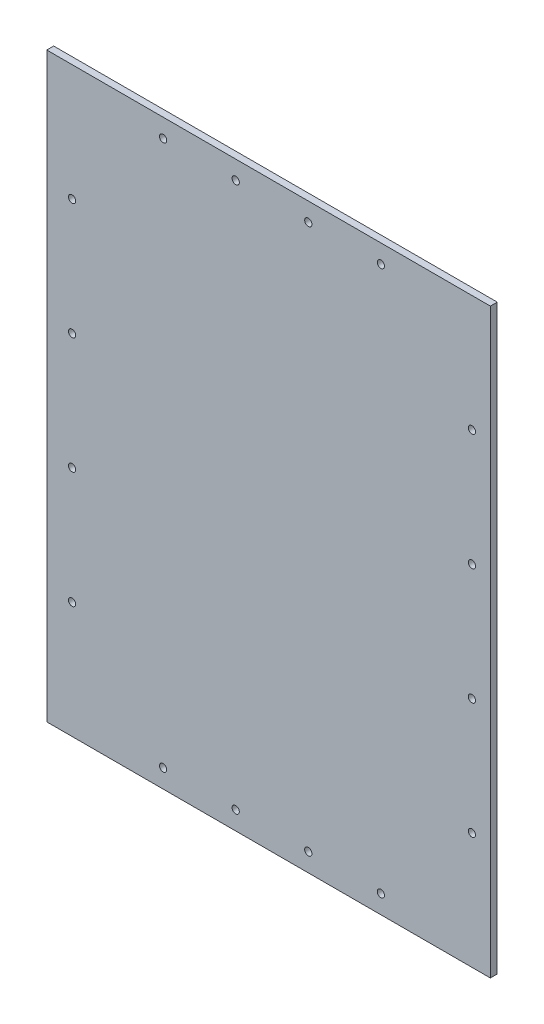
ISO-10303-21;
HEADER;
FILE_DESCRIPTION(('STEP AP214'),'2;1');
FILE_NAME('part.step','',(''),(''),'','','');
FILE_SCHEMA(('AUTOMOTIVE_DESIGN { 1 0 10303 214 1 1 1 1 }'));
ENDSEC;
DATA;
#1=APPLICATION_CONTEXT('core data for automotive mechanical design processes');
#2=APPLICATION_PROTOCOL_DEFINITION('international standard','automotive_design',2000,#1);
#3=PRODUCT_CONTEXT('',#1,'mechanical');
#4=PRODUCT('Part','Part','',(#3));
#5=PRODUCT_RELATED_PRODUCT_CATEGORY('part','',(#4));
#6=PRODUCT_DEFINITION_FORMATION('','',#4);
#7=PRODUCT_DEFINITION_CONTEXT('part definition',#1,'design');
#8=PRODUCT_DEFINITION('design','',#6,#7);
#9=PRODUCT_DEFINITION_SHAPE('','',#8);
#10=(LENGTH_UNIT() NAMED_UNIT(*) SI_UNIT(.MILLI.,.METRE.));
#11=(NAMED_UNIT(*) PLANE_ANGLE_UNIT() SI_UNIT($,.RADIAN.));
#12=(NAMED_UNIT(*) SI_UNIT($,.STERADIAN.) SOLID_ANGLE_UNIT());
#13=UNCERTAINTY_MEASURE_WITH_UNIT(LENGTH_MEASURE(1.E-05),#10,'distance_accuracy_value','');
#14=(GEOMETRIC_REPRESENTATION_CONTEXT(3) GLOBAL_UNCERTAINTY_ASSIGNED_CONTEXT((#13)) GLOBAL_UNIT_ASSIGNED_CONTEXT((#10,
#11,#12)) REPRESENTATION_CONTEXT('',''));
#15=CARTESIAN_POINT('',(0.,0.,0.));
#16=DIRECTION('',(0.,0.,1.));
#17=DIRECTION('',(1.,0.,0.));
#18=AXIS2_PLACEMENT_3D('',#15,#16,#17);
#19=CARTESIAN_POINT('',(-152.775,198.025,-0.00999999999999959));
#20=DIRECTION('',(0.,-1.,0.));
#21=DIRECTION('',(1.,0.,0.));
#22=AXIS2_PLACEMENT_3D('',#19,#20,#21);
#23=PLANE('',#22);
#24=DIRECTION('',(0.,0.,-1.));
#25=VECTOR('',#24,1.);
#26=CARTESIAN_POINT('',(-152.775,198.025,4.75));
#27=LINE('',#26,#25);
#28=CARTESIAN_POINT('',(-152.775,198.025,4.75));
#29=VERTEX_POINT('',#28);
#30=CARTESIAN_POINT('',(-152.775,198.025,0.));
#31=VERTEX_POINT('',#30);
#32=EDGE_CURVE('E40',#29,#31,#27,.T.);
#33=ORIENTED_EDGE('',*,*,#32,.F.);
#34=DIRECTION('',(1.,0.,0.));
#35=VECTOR('',#34,1.);
#36=CARTESIAN_POINT('',(0.,198.025,4.75));
#37=LINE('',#36,#35);
#38=CARTESIAN_POINT('',(152.775,198.025,4.75));
#39=VERTEX_POINT('',#38);
#40=EDGE_CURVE('E11',#29,#39,#37,.T.);
#41=ORIENTED_EDGE('',*,*,#40,.T.);
#42=DIRECTION('',(0.,0.,1.));
#43=VECTOR('',#42,1.);
#44=CARTESIAN_POINT('',(152.775,198.025,-0.00999999999999959));
#45=LINE('',#44,#43);
#46=CARTESIAN_POINT('',(152.775,198.025,0.));
#47=VERTEX_POINT('',#46);
#48=EDGE_CURVE('E35',#47,#39,#45,.T.);
#49=ORIENTED_EDGE('',*,*,#48,.F.);
#50=DIRECTION('',(1.,0.,0.));
#51=VECTOR('',#50,1.);
#52=CARTESIAN_POINT('',(0.,198.025,0.));
#53=LINE('',#52,#51);
#54=EDGE_CURVE('E94',#31,#47,#53,.T.);
#55=ORIENTED_EDGE('',*,*,#54,.F.);
#56=EDGE_LOOP('',(#33,#41,#49,#55));
#57=FACE_BOUND('',#56,.T.);
#58=ADVANCED_FACE('F32',(#57),#23,.F.);
#59=CARTESIAN_POINT('',(152.775,-202.775,4.75));
#60=DIRECTION('',(0.,1.,0.));
#61=DIRECTION('',(-1.,0.,0.));
#62=AXIS2_PLACEMENT_3D('',#59,#60,#61);
#63=PLANE('',#62);
#64=DIRECTION('',(1.,0.,0.));
#65=VECTOR('',#64,1.);
#66=CARTESIAN_POINT('',(152.775,-202.775,0.));
#67=LINE('',#66,#65);
#68=CARTESIAN_POINT('',(-152.775,-202.775,0.));
#69=VERTEX_POINT('',#68);
#70=CARTESIAN_POINT('',(152.775,-202.775,0.));
#71=VERTEX_POINT('',#70);
#72=EDGE_CURVE('E130',#69,#71,#67,.T.);
#73=ORIENTED_EDGE('',*,*,#72,.T.);
#74=DIRECTION('',(0.,0.,-1.));
#75=VECTOR('',#74,1.);
#76=CARTESIAN_POINT('',(152.775,-202.775,4.75));
#77=LINE('',#76,#75);
#78=CARTESIAN_POINT('',(152.775,-202.775,4.75));
#79=VERTEX_POINT('',#78);
#80=EDGE_CURVE('E87',#79,#71,#77,.T.);
#81=ORIENTED_EDGE('',*,*,#80,.F.);
#82=DIRECTION('',(1.,0.,0.));
#83=VECTOR('',#82,1.);
#84=CARTESIAN_POINT('',(152.775,-202.775,4.75));
#85=LINE('',#84,#83);
#86=CARTESIAN_POINT('',(-152.775,-202.775,4.75));
#87=VERTEX_POINT('',#86);
#88=EDGE_CURVE('E75',#87,#79,#85,.T.);
#89=ORIENTED_EDGE('',*,*,#88,.F.);
#90=DIRECTION('',(0.,0.,-1.));
#91=VECTOR('',#90,1.);
#92=CARTESIAN_POINT('',(-152.775,-202.775,4.75));
#93=LINE('',#92,#91);
#94=EDGE_CURVE('E85',#87,#69,#93,.T.);
#95=ORIENTED_EDGE('',*,*,#94,.T.);
#96=EDGE_LOOP('',(#73,#81,#89,#95));
#97=FACE_BOUND('',#96,.T.);
#98=ADVANCED_FACE('F84',(#97),#63,.F.);
#99=CARTESIAN_POINT('',(152.775,-202.775,4.75));
#100=DIRECTION('',(-1.,0.,0.));
#101=DIRECTION('',(0.,0.,1.));
#102=AXIS2_PLACEMENT_3D('',#99,#100,#101);
#103=PLANE('',#102);
#104=DIRECTION('',(0.,1.,0.));
#105=VECTOR('',#104,1.);
#106=CARTESIAN_POINT('',(152.775,-202.775,0.));
#107=LINE('',#106,#105);
#108=EDGE_CURVE('E80',#71,#47,#107,.T.);
#109=ORIENTED_EDGE('',*,*,#108,.T.);
#110=ORIENTED_EDGE('',*,*,#48,.T.);
#111=DIRECTION('',(0.,1.,0.));
#112=VECTOR('',#111,1.);
#113=CARTESIAN_POINT('',(152.775,-202.775,4.75));
#114=LINE('',#113,#112);
#115=EDGE_CURVE('E88',#79,#39,#114,.T.);
#116=ORIENTED_EDGE('',*,*,#115,.F.);
#117=ORIENTED_EDGE('',*,*,#80,.T.);
#118=EDGE_LOOP('',(#109,#110,#116,#117));
#119=FACE_BOUND('',#118,.T.);
#120=ADVANCED_FACE('F134',(#119),#103,.F.);
#121=CARTESIAN_POINT('',(-152.775,-202.775,4.75));
#122=DIRECTION('',(1.,0.,0.));
#123=DIRECTION('',(0.,0.,-1.));
#124=AXIS2_PLACEMENT_3D('',#121,#122,#123);
#125=PLANE('',#124);
#126=DIRECTION('',(0.,-1.,0.));
#127=VECTOR('',#126,1.);
#128=CARTESIAN_POINT('',(-152.775,-202.775,4.75));
#129=LINE('',#128,#127);
#130=EDGE_CURVE('E71',#29,#87,#129,.T.);
#131=ORIENTED_EDGE('',*,*,#130,.F.);
#132=ORIENTED_EDGE('',*,*,#32,.T.);
#133=DIRECTION('',(0.,-1.,0.));
#134=VECTOR('',#133,1.);
#135=CARTESIAN_POINT('',(-152.775,-202.775,0.));
#136=LINE('',#135,#134);
#137=EDGE_CURVE('E92',#31,#69,#136,.T.);
#138=ORIENTED_EDGE('',*,*,#137,.T.);
#139=ORIENTED_EDGE('',*,*,#94,.F.);
#140=EDGE_LOOP('',(#131,#132,#138,#139));
#141=FACE_BOUND('',#140,.T.);
#142=ADVANCED_FACE('F90',(#141),#125,.F.);
#143=CARTESIAN_POINT('',(140.075,37.705,-5.25));
#144=DIRECTION('',(0.,0.,1.));
#145=DIRECTION('',(1.,0.,0.));
#146=AXIS2_PLACEMENT_3D('',#143,#144,#145);
#147=CYLINDRICAL_SURFACE('',#146,2.5);
#148=CARTESIAN_POINT('',(140.075,37.705,4.75));
#149=DIRECTION('',(0.,0.,1.));
#150=DIRECTION('',(1.,0.,0.));
#151=AXIS2_PLACEMENT_3D('',#148,#149,#150);
#152=CIRCLE('',#151,2.5);
#153=CARTESIAN_POINT('',(142.575,37.705,4.75));
#154=VERTEX_POINT('',#153);
#155=EDGE_CURVE('E104',#154,#154,#152,.T.);
#156=ORIENTED_EDGE('',*,*,#155,.T.);
#157=EDGE_LOOP('',(#156));
#158=FACE_BOUND('',#157,.T.);
#159=CARTESIAN_POINT('',(140.075,37.705,0.));
#160=DIRECTION('',(0.,0.,1.));
#161=DIRECTION('',(1.,0.,0.));
#162=AXIS2_PLACEMENT_3D('',#159,#160,#161);
#163=CIRCLE('',#162,2.5);
#164=CARTESIAN_POINT('',(142.575,37.705,0.));
#165=VERTEX_POINT('',#164);
#166=EDGE_CURVE('E100',#165,#165,#163,.T.);
#167=ORIENTED_EDGE('',*,*,#166,.F.);
#168=EDGE_LOOP('',(#167));
#169=FACE_BOUND('',#168,.T.);
#170=ADVANCED_FACE('F141',(#158,#169),#147,.F.);
#171=CARTESIAN_POINT('',(140.075,117.865,-5.25));
#172=DIRECTION('',(0.,0.,1.));
#173=DIRECTION('',(1.,0.,0.));
#174=AXIS2_PLACEMENT_3D('',#171,#172,#173);
#175=CYLINDRICAL_SURFACE('',#174,2.5);
#176=CARTESIAN_POINT('',(140.075,117.865,4.75));
#177=DIRECTION('',(0.,0.,1.));
#178=DIRECTION('',(1.,0.,0.));
#179=AXIS2_PLACEMENT_3D('',#176,#177,#178);
#180=CIRCLE('',#179,2.5);
#181=CARTESIAN_POINT('',(142.575,117.865,4.75));
#182=VERTEX_POINT('',#181);
#183=EDGE_CURVE('E284',#182,#182,#180,.T.);
#184=ORIENTED_EDGE('',*,*,#183,.T.);
#185=EDGE_LOOP('',(#184));
#186=FACE_BOUND('',#185,.T.);
#187=CARTESIAN_POINT('',(140.075,117.865,0.));
#188=DIRECTION('',(0.,0.,1.));
#189=DIRECTION('',(1.,0.,0.));
#190=AXIS2_PLACEMENT_3D('',#187,#188,#189);
#191=CIRCLE('',#190,2.5);
#192=CARTESIAN_POINT('',(142.575,117.865,0.));
#193=VERTEX_POINT('',#192);
#194=EDGE_CURVE('E103',#193,#193,#191,.T.);
#195=ORIENTED_EDGE('',*,*,#194,.F.);
#196=EDGE_LOOP('',(#195));
#197=FACE_BOUND('',#196,.T.);
#198=ADVANCED_FACE('F158',(#186,#197),#175,.F.);
#199=CARTESIAN_POINT('',(140.075,-42.455,-5.25));
#200=DIRECTION('',(0.,0.,1.));
#201=DIRECTION('',(1.,0.,0.));
#202=AXIS2_PLACEMENT_3D('',#199,#200,#201);
#203=CYLINDRICAL_SURFACE('',#202,2.5);
#204=CARTESIAN_POINT('',(140.075,-42.455,4.75));
#205=DIRECTION('',(0.,0.,1.));
#206=DIRECTION('',(1.,0.,0.));
#207=AXIS2_PLACEMENT_3D('',#204,#205,#206);
#208=CIRCLE('',#207,2.5);
#209=CARTESIAN_POINT('',(142.575,-42.455,4.75));
#210=VERTEX_POINT('',#209);
#211=EDGE_CURVE('E287',#210,#210,#208,.T.);
#212=ORIENTED_EDGE('',*,*,#211,.T.);
#213=EDGE_LOOP('',(#212));
#214=FACE_BOUND('',#213,.T.);
#215=CARTESIAN_POINT('',(140.075,-42.455,0.));
#216=DIRECTION('',(0.,0.,1.));
#217=DIRECTION('',(1.,0.,0.));
#218=AXIS2_PLACEMENT_3D('',#215,#216,#217);
#219=CIRCLE('',#218,2.5);
#220=CARTESIAN_POINT('',(142.575,-42.455,0.));
#221=VERTEX_POINT('',#220);
#222=EDGE_CURVE('E107',#221,#221,#219,.T.);
#223=ORIENTED_EDGE('',*,*,#222,.F.);
#224=EDGE_LOOP('',(#223));
#225=FACE_BOUND('',#224,.T.);
#226=ADVANCED_FACE('F164',(#214,#225),#203,.F.);
#227=CARTESIAN_POINT('',(140.075,-122.615,-5.25));
#228=DIRECTION('',(0.,0.,1.));
#229=DIRECTION('',(1.,0.,0.));
#230=AXIS2_PLACEMENT_3D('',#227,#228,#229);
#231=CYLINDRICAL_SURFACE('',#230,2.5);
#232=CARTESIAN_POINT('',(140.075,-122.615,4.75));
#233=DIRECTION('',(0.,0.,1.));
#234=DIRECTION('',(1.,0.,0.));
#235=AXIS2_PLACEMENT_3D('',#232,#233,#234);
#236=CIRCLE('',#235,2.5);
#237=CARTESIAN_POINT('',(142.575,-122.615,4.75));
#238=VERTEX_POINT('',#237);
#239=EDGE_CURVE('E125',#238,#238,#236,.T.);
#240=ORIENTED_EDGE('',*,*,#239,.T.);
#241=EDGE_LOOP('',(#240));
#242=FACE_BOUND('',#241,.T.);
#243=CARTESIAN_POINT('',(140.075,-122.615,0.));
#244=DIRECTION('',(0.,0.,1.));
#245=DIRECTION('',(1.,0.,0.));
#246=AXIS2_PLACEMENT_3D('',#243,#244,#245);
#247=CIRCLE('',#246,2.5);
#248=CARTESIAN_POINT('',(142.575,-122.615,0.));
#249=VERTEX_POINT('',#248);
#250=EDGE_CURVE('E110',#249,#249,#247,.T.);
#251=ORIENTED_EDGE('',*,*,#250,.F.);
#252=EDGE_LOOP('',(#251));
#253=FACE_BOUND('',#252,.T.);
#254=ADVANCED_FACE('F160',(#242,#253),#231,.F.);
#255=CARTESIAN_POINT('',(-135.325,117.865,-5.25));
#256=DIRECTION('',(0.,0.,1.));
#257=DIRECTION('',(1.,0.,0.));
#258=AXIS2_PLACEMENT_3D('',#255,#256,#257);
#259=CYLINDRICAL_SURFACE('',#258,2.5);
#260=CARTESIAN_POINT('',(-135.325,117.865,4.75));
#261=DIRECTION('',(0.,0.,1.));
#262=DIRECTION('',(1.,0.,0.));
#263=AXIS2_PLACEMENT_3D('',#260,#261,#262);
#264=CIRCLE('',#263,2.5);
#265=CARTESIAN_POINT('',(-132.825,117.865,4.75));
#266=VERTEX_POINT('',#265);
#267=EDGE_CURVE('E273',#266,#266,#264,.T.);
#268=ORIENTED_EDGE('',*,*,#267,.T.);
#269=EDGE_LOOP('',(#268));
#270=FACE_BOUND('',#269,.T.);
#271=CARTESIAN_POINT('',(-135.325,117.865,0.));
#272=DIRECTION('',(0.,0.,1.));
#273=DIRECTION('',(1.,0.,0.));
#274=AXIS2_PLACEMENT_3D('',#271,#272,#273);
#275=CIRCLE('',#274,2.5);
#276=CARTESIAN_POINT('',(-132.825,117.865,0.));
#277=VERTEX_POINT('',#276);
#278=EDGE_CURVE('E113',#277,#277,#275,.T.);
#279=ORIENTED_EDGE('',*,*,#278,.F.);
#280=EDGE_LOOP('',(#279));
#281=FACE_BOUND('',#280,.T.);
#282=ADVANCED_FACE('F163',(#270,#281),#259,.F.);
#283=CARTESIAN_POINT('',(-135.325,37.705,-5.25));
#284=DIRECTION('',(0.,0.,1.));
#285=DIRECTION('',(1.,0.,0.));
#286=AXIS2_PLACEMENT_3D('',#283,#284,#285);
#287=CYLINDRICAL_SURFACE('',#286,2.5);
#288=CARTESIAN_POINT('',(-135.325,37.705,4.75));
#289=DIRECTION('',(0.,0.,1.));
#290=DIRECTION('',(1.,0.,0.));
#291=AXIS2_PLACEMENT_3D('',#288,#289,#290);
#292=CIRCLE('',#291,2.5);
#293=CARTESIAN_POINT('',(-132.825,37.705,4.75));
#294=VERTEX_POINT('',#293);
#295=EDGE_CURVE('E279',#294,#294,#292,.T.);
#296=ORIENTED_EDGE('',*,*,#295,.T.);
#297=EDGE_LOOP('',(#296));
#298=FACE_BOUND('',#297,.T.);
#299=CARTESIAN_POINT('',(-135.325,37.705,0.));
#300=DIRECTION('',(0.,0.,1.));
#301=DIRECTION('',(1.,0.,0.));
#302=AXIS2_PLACEMENT_3D('',#299,#300,#301);
#303=CIRCLE('',#302,2.5);
#304=CARTESIAN_POINT('',(-132.825,37.705,0.));
#305=VERTEX_POINT('',#304);
#306=EDGE_CURVE('E116',#305,#305,#303,.T.);
#307=ORIENTED_EDGE('',*,*,#306,.F.);
#308=EDGE_LOOP('',(#307));
#309=FACE_BOUND('',#308,.T.);
#310=ADVANCED_FACE('F174',(#298,#309),#287,.F.);
#311=CARTESIAN_POINT('',(-135.325,-42.455,-5.25));
#312=DIRECTION('',(0.,0.,1.));
#313=DIRECTION('',(1.,0.,0.));
#314=AXIS2_PLACEMENT_3D('',#311,#312,#313);
#315=CYLINDRICAL_SURFACE('',#314,2.5);
#316=CARTESIAN_POINT('',(-135.325,-42.455,4.75));
#317=DIRECTION('',(0.,0.,1.));
#318=DIRECTION('',(1.,0.,0.));
#319=AXIS2_PLACEMENT_3D('',#316,#317,#318);
#320=CIRCLE('',#319,2.5);
#321=CARTESIAN_POINT('',(-132.825,-42.455,4.75));
#322=VERTEX_POINT('',#321);
#323=EDGE_CURVE('E276',#322,#322,#320,.T.);
#324=ORIENTED_EDGE('',*,*,#323,.T.);
#325=EDGE_LOOP('',(#324));
#326=FACE_BOUND('',#325,.T.);
#327=CARTESIAN_POINT('',(-135.325,-42.455,0.));
#328=DIRECTION('',(0.,0.,1.));
#329=DIRECTION('',(1.,0.,0.));
#330=AXIS2_PLACEMENT_3D('',#327,#328,#329);
#331=CIRCLE('',#330,2.5);
#332=CARTESIAN_POINT('',(-132.825,-42.455,0.));
#333=VERTEX_POINT('',#332);
#334=EDGE_CURVE('E120',#333,#333,#331,.T.);
#335=ORIENTED_EDGE('',*,*,#334,.F.);
#336=EDGE_LOOP('',(#335));
#337=FACE_BOUND('',#336,.T.);
#338=ADVANCED_FACE('F178',(#326,#337),#315,.F.);
#339=CARTESIAN_POINT('',(-135.325,-122.615,-5.25));
#340=DIRECTION('',(0.,0.,1.));
#341=DIRECTION('',(1.,0.,0.));
#342=AXIS2_PLACEMENT_3D('',#339,#340,#341);
#343=CYLINDRICAL_SURFACE('',#342,2.5);
#344=CARTESIAN_POINT('',(-135.325,-122.615,4.75));
#345=DIRECTION('',(0.,0.,1.));
#346=DIRECTION('',(1.,0.,0.));
#347=AXIS2_PLACEMENT_3D('',#344,#345,#346);
#348=CIRCLE('',#347,2.5);
#349=CARTESIAN_POINT('',(-132.825,-122.615,4.75));
#350=VERTEX_POINT('',#349);
#351=EDGE_CURVE('E117',#350,#350,#348,.T.);
#352=ORIENTED_EDGE('',*,*,#351,.T.);
#353=EDGE_LOOP('',(#352));
#354=FACE_BOUND('',#353,.T.);
#355=CARTESIAN_POINT('',(-135.325,-122.615,0.));
#356=DIRECTION('',(0.,0.,1.));
#357=DIRECTION('',(1.,0.,0.));
#358=AXIS2_PLACEMENT_3D('',#355,#356,#357);
#359=CIRCLE('',#358,2.5);
#360=CARTESIAN_POINT('',(-132.825,-122.615,0.));
#361=VERTEX_POINT('',#360);
#362=EDGE_CURVE('E123',#361,#361,#359,.T.);
#363=ORIENTED_EDGE('',*,*,#362,.F.);
#364=EDGE_LOOP('',(#363));
#365=FACE_BOUND('',#364,.T.);
#366=ADVANCED_FACE('F182',(#354,#365),#343,.F.);
#367=CARTESIAN_POINT('',(-22.625,185.325,10.));
#368=DIRECTION('',(0.,0.,-1.));
#369=DIRECTION('',(-1.,0.,0.));
#370=AXIS2_PLACEMENT_3D('',#367,#368,#369);
#371=CYLINDRICAL_SURFACE('',#370,2.5);
#372=CARTESIAN_POINT('',(-22.625,185.325,4.75));
#373=DIRECTION('',(0.,0.,1.));
#374=DIRECTION('',(1.,0.,0.));
#375=AXIS2_PLACEMENT_3D('',#372,#373,#374);
#376=CIRCLE('',#375,2.5);
#377=CARTESIAN_POINT('',(-20.125,185.325,4.75));
#378=VERTEX_POINT('',#377);
#379=EDGE_CURVE('E261',#378,#378,#376,.T.);
#380=ORIENTED_EDGE('',*,*,#379,.T.);
#381=EDGE_LOOP('',(#380));
#382=FACE_BOUND('',#381,.T.);
#383=CARTESIAN_POINT('',(-22.625,185.325,0.));
#384=DIRECTION('',(0.,0.,-1.));
#385=DIRECTION('',(-1.,0.,0.));
#386=AXIS2_PLACEMENT_3D('',#383,#384,#385);
#387=CIRCLE('',#386,2.5);
#388=CARTESIAN_POINT('',(-25.125,185.325,0.));
#389=VERTEX_POINT('',#388);
#390=EDGE_CURVE('E256',#389,#389,#387,.T.);
#391=ORIENTED_EDGE('',*,*,#390,.T.);
#392=EDGE_LOOP('',(#391));
#393=FACE_BOUND('',#392,.T.);
#394=ADVANCED_FACE('F186',(#382,#393),#371,.F.);
#395=CARTESIAN_POINT('',(27.375,185.325,10.));
#396=DIRECTION('',(0.,0.,-1.));
#397=DIRECTION('',(-1.,0.,0.));
#398=AXIS2_PLACEMENT_3D('',#395,#396,#397);
#399=CYLINDRICAL_SURFACE('',#398,2.5);
#400=CARTESIAN_POINT('',(27.375,185.325,4.75));
#401=DIRECTION('',(0.,0.,1.));
#402=DIRECTION('',(1.,0.,0.));
#403=AXIS2_PLACEMENT_3D('',#400,#401,#402);
#404=CIRCLE('',#403,2.5);
#405=CARTESIAN_POINT('',(29.875,185.325,4.75));
#406=VERTEX_POINT('',#405);
#407=EDGE_CURVE('E264',#406,#406,#404,.T.);
#408=ORIENTED_EDGE('',*,*,#407,.T.);
#409=EDGE_LOOP('',(#408));
#410=FACE_BOUND('',#409,.T.);
#411=CARTESIAN_POINT('',(27.375,185.325,0.));
#412=DIRECTION('',(0.,0.,-1.));
#413=DIRECTION('',(-1.,0.,0.));
#414=AXIS2_PLACEMENT_3D('',#411,#412,#413);
#415=CIRCLE('',#414,2.5);
#416=CARTESIAN_POINT('',(24.875,185.325,0.));
#417=VERTEX_POINT('',#416);
#418=EDGE_CURVE('E249',#417,#417,#415,.T.);
#419=ORIENTED_EDGE('',*,*,#418,.T.);
#420=EDGE_LOOP('',(#419));
#421=FACE_BOUND('',#420,.T.);
#422=ADVANCED_FACE('F190',(#410,#421),#399,.F.);
#423=CARTESIAN_POINT('',(77.375,185.325,10.));
#424=DIRECTION('',(0.,0.,-1.));
#425=DIRECTION('',(-1.,0.,0.));
#426=AXIS2_PLACEMENT_3D('',#423,#424,#425);
#427=CYLINDRICAL_SURFACE('',#426,2.50000000000001);
#428=CARTESIAN_POINT('',(77.375,185.325,4.75));
#429=DIRECTION('',(0.,0.,1.));
#430=DIRECTION('',(1.,0.,0.));
#431=AXIS2_PLACEMENT_3D('',#428,#429,#430);
#432=CIRCLE('',#431,2.50000000000001);
#433=CARTESIAN_POINT('',(79.875,185.325,4.75));
#434=VERTEX_POINT('',#433);
#435=EDGE_CURVE('E267',#434,#434,#432,.T.);
#436=ORIENTED_EDGE('',*,*,#435,.T.);
#437=EDGE_LOOP('',(#436));
#438=FACE_BOUND('',#437,.T.);
#439=CARTESIAN_POINT('',(77.375,185.325,0.));
#440=DIRECTION('',(0.,0.,-1.));
#441=DIRECTION('',(-1.,0.,0.));
#442=AXIS2_PLACEMENT_3D('',#439,#440,#441);
#443=CIRCLE('',#442,2.50000000000001);
#444=CARTESIAN_POINT('',(74.8749999999999,185.325,0.));
#445=VERTEX_POINT('',#444);
#446=EDGE_CURVE('E252',#445,#445,#443,.T.);
#447=ORIENTED_EDGE('',*,*,#446,.T.);
#448=EDGE_LOOP('',(#447));
#449=FACE_BOUND('',#448,.T.);
#450=ADVANCED_FACE('F192',(#438,#449),#427,.F.);
#451=CARTESIAN_POINT('',(-72.6250000000001,185.325,10.));
#452=DIRECTION('',(0.,0.,-1.));
#453=DIRECTION('',(-1.,0.,0.));
#454=AXIS2_PLACEMENT_3D('',#451,#452,#453);
#455=CYLINDRICAL_SURFACE('',#454,2.5);
#456=CARTESIAN_POINT('',(-72.6250000000001,185.325,4.75));
#457=DIRECTION('',(0.,0.,1.));
#458=DIRECTION('',(1.,0.,0.));
#459=AXIS2_PLACEMENT_3D('',#456,#457,#458);
#460=CIRCLE('',#459,2.5);
#461=CARTESIAN_POINT('',(-70.125,185.325,4.75));
#462=VERTEX_POINT('',#461);
#463=EDGE_CURVE('E270',#462,#462,#460,.T.);
#464=ORIENTED_EDGE('',*,*,#463,.T.);
#465=EDGE_LOOP('',(#464));
#466=FACE_BOUND('',#465,.T.);
#467=CARTESIAN_POINT('',(-72.6250000000001,185.325,0.));
#468=DIRECTION('',(0.,0.,-1.));
#469=DIRECTION('',(-1.,0.,0.));
#470=AXIS2_PLACEMENT_3D('',#467,#468,#469);
#471=CIRCLE('',#470,2.5);
#472=CARTESIAN_POINT('',(-75.1250000000001,185.325,0.));
#473=VERTEX_POINT('',#472);
#474=EDGE_CURVE('E253',#473,#473,#471,.T.);
#475=ORIENTED_EDGE('',*,*,#474,.T.);
#476=EDGE_LOOP('',(#475));
#477=FACE_BOUND('',#476,.T.);
#478=ADVANCED_FACE('F195',(#466,#477),#455,.F.);
#479=CARTESIAN_POINT('',(-72.6250000000001,-190.075,10.));
#480=DIRECTION('',(0.,0.,-1.));
#481=DIRECTION('',(-1.,0.,0.));
#482=AXIS2_PLACEMENT_3D('',#479,#480,#481);
#483=CYLINDRICAL_SURFACE('',#482,2.5);
#484=CARTESIAN_POINT('',(-72.6250000000001,-190.075,4.75));
#485=DIRECTION('',(0.,0.,1.));
#486=DIRECTION('',(1.,0.,0.));
#487=AXIS2_PLACEMENT_3D('',#484,#485,#486);
#488=CIRCLE('',#487,2.5);
#489=CARTESIAN_POINT('',(-70.125,-190.075,4.75));
#490=VERTEX_POINT('',#489);
#491=EDGE_CURVE('E228',#490,#490,#488,.T.);
#492=ORIENTED_EDGE('',*,*,#491,.T.);
#493=EDGE_LOOP('',(#492));
#494=FACE_BOUND('',#493,.T.);
#495=CARTESIAN_POINT('',(-72.6250000000001,-190.075,0.));
#496=DIRECTION('',(0.,0.,-1.));
#497=DIRECTION('',(-1.,0.,0.));
#498=AXIS2_PLACEMENT_3D('',#495,#496,#497);
#499=CIRCLE('',#498,2.5);
#500=CARTESIAN_POINT('',(-75.1250000000001,-190.075,0.));
#501=VERTEX_POINT('',#500);
#502=EDGE_CURVE('E240',#501,#501,#499,.T.);
#503=ORIENTED_EDGE('',*,*,#502,.T.);
#504=EDGE_LOOP('',(#503));
#505=FACE_BOUND('',#504,.T.);
#506=ADVANCED_FACE('F199',(#494,#505),#483,.F.);
#507=CARTESIAN_POINT('',(-22.625,-190.075,10.));
#508=DIRECTION('',(0.,0.,-1.));
#509=DIRECTION('',(-1.,0.,0.));
#510=AXIS2_PLACEMENT_3D('',#507,#508,#509);
#511=CYLINDRICAL_SURFACE('',#510,2.5);
#512=CARTESIAN_POINT('',(-22.625,-190.075,4.75));
#513=DIRECTION('',(0.,0.,1.));
#514=DIRECTION('',(1.,0.,0.));
#515=AXIS2_PLACEMENT_3D('',#512,#513,#514);
#516=CIRCLE('',#515,2.5);
#517=CARTESIAN_POINT('',(-20.125,-190.075,4.75));
#518=VERTEX_POINT('',#517);
#519=EDGE_CURVE('E232',#518,#518,#516,.T.);
#520=ORIENTED_EDGE('',*,*,#519,.T.);
#521=EDGE_LOOP('',(#520));
#522=FACE_BOUND('',#521,.T.);
#523=CARTESIAN_POINT('',(-22.625,-190.075,0.));
#524=DIRECTION('',(0.,0.,-1.));
#525=DIRECTION('',(-1.,0.,0.));
#526=AXIS2_PLACEMENT_3D('',#523,#524,#525);
#527=CIRCLE('',#526,2.5);
#528=CARTESIAN_POINT('',(-25.125,-190.075,0.));
#529=VERTEX_POINT('',#528);
#530=EDGE_CURVE('E235',#529,#529,#527,.T.);
#531=ORIENTED_EDGE('',*,*,#530,.T.);
#532=EDGE_LOOP('',(#531));
#533=FACE_BOUND('',#532,.T.);
#534=ADVANCED_FACE('F206',(#522,#533),#511,.F.);
#535=CARTESIAN_POINT('',(27.375,-190.075,10.));
#536=DIRECTION('',(0.,0.,-1.));
#537=DIRECTION('',(-1.,0.,0.));
#538=AXIS2_PLACEMENT_3D('',#535,#536,#537);
#539=CYLINDRICAL_SURFACE('',#538,2.5);
#540=CARTESIAN_POINT('',(27.375,-190.075,4.75));
#541=DIRECTION('',(0.,0.,1.));
#542=DIRECTION('',(1.,0.,0.));
#543=AXIS2_PLACEMENT_3D('',#540,#541,#542);
#544=CIRCLE('',#543,2.5);
#545=CARTESIAN_POINT('',(29.875,-190.075,4.75));
#546=VERTEX_POINT('',#545);
#547=EDGE_CURVE('E245',#546,#546,#544,.T.);
#548=ORIENTED_EDGE('',*,*,#547,.T.);
#549=EDGE_LOOP('',(#548));
#550=FACE_BOUND('',#549,.T.);
#551=CARTESIAN_POINT('',(27.375,-190.075,0.));
#552=DIRECTION('',(0.,0.,-1.));
#553=DIRECTION('',(-1.,0.,0.));
#554=AXIS2_PLACEMENT_3D('',#551,#552,#553);
#555=CIRCLE('',#554,2.5);
#556=CARTESIAN_POINT('',(24.875,-190.075,0.));
#557=VERTEX_POINT('',#556);
#558=EDGE_CURVE('E229',#557,#557,#555,.T.);
#559=ORIENTED_EDGE('',*,*,#558,.T.);
#560=EDGE_LOOP('',(#559));
#561=FACE_BOUND('',#560,.T.);
#562=ADVANCED_FACE('F210',(#550,#561),#539,.F.);
#563=CARTESIAN_POINT('',(77.375,-190.075,10.));
#564=DIRECTION('',(0.,0.,-1.));
#565=DIRECTION('',(-1.,0.,0.));
#566=AXIS2_PLACEMENT_3D('',#563,#564,#565);
#567=CYLINDRICAL_SURFACE('',#566,2.50000000000001);
#568=CARTESIAN_POINT('',(77.375,-190.075,4.75));
#569=DIRECTION('',(0.,0.,1.));
#570=DIRECTION('',(1.,0.,0.));
#571=AXIS2_PLACEMENT_3D('',#568,#569,#570);
#572=CIRCLE('',#571,2.50000000000001);
#573=CARTESIAN_POINT('',(79.875,-190.075,4.75));
#574=VERTEX_POINT('',#573);
#575=EDGE_CURVE('E224',#574,#574,#572,.T.);
#576=ORIENTED_EDGE('',*,*,#575,.T.);
#577=EDGE_LOOP('',(#576));
#578=FACE_BOUND('',#577,.T.);
#579=CARTESIAN_POINT('',(77.375,-190.075,0.));
#580=DIRECTION('',(0.,0.,-1.));
#581=DIRECTION('',(-1.,0.,0.));
#582=AXIS2_PLACEMENT_3D('',#579,#580,#581);
#583=CIRCLE('',#582,2.50000000000001);
#584=CARTESIAN_POINT('',(74.8749999999999,-190.075,0.));
#585=VERTEX_POINT('',#584);
#586=EDGE_CURVE('E227',#585,#585,#583,.T.);
#587=ORIENTED_EDGE('',*,*,#586,.T.);
#588=EDGE_LOOP('',(#587));
#589=FACE_BOUND('',#588,.T.);
#590=ADVANCED_FACE('F153',(#578,#589),#567,.F.);
#591=CARTESIAN_POINT('',(0.,0.,0.));
#592=DIRECTION('',(0.,0.,1.));
#593=DIRECTION('',(1.,0.,0.));
#594=AXIS2_PLACEMENT_3D('',#591,#592,#593);
#595=PLANE('',#594);
#596=ORIENTED_EDGE('',*,*,#586,.F.);
#597=EDGE_LOOP('',(#596));
#598=FACE_BOUND('',#597,.T.);
#599=ORIENTED_EDGE('',*,*,#558,.F.);
#600=EDGE_LOOP('',(#599));
#601=FACE_BOUND('',#600,.T.);
#602=ORIENTED_EDGE('',*,*,#530,.F.);
#603=EDGE_LOOP('',(#602));
#604=FACE_BOUND('',#603,.T.);
#605=ORIENTED_EDGE('',*,*,#502,.F.);
#606=EDGE_LOOP('',(#605));
#607=FACE_BOUND('',#606,.T.);
#608=ORIENTED_EDGE('',*,*,#474,.F.);
#609=EDGE_LOOP('',(#608));
#610=FACE_BOUND('',#609,.T.);
#611=ORIENTED_EDGE('',*,*,#446,.F.);
#612=EDGE_LOOP('',(#611));
#613=FACE_BOUND('',#612,.T.);
#614=ORIENTED_EDGE('',*,*,#418,.F.);
#615=EDGE_LOOP('',(#614));
#616=FACE_BOUND('',#615,.T.);
#617=ORIENTED_EDGE('',*,*,#390,.F.);
#618=EDGE_LOOP('',(#617));
#619=FACE_BOUND('',#618,.T.);
#620=ORIENTED_EDGE('',*,*,#362,.T.);
#621=EDGE_LOOP('',(#620));
#622=FACE_BOUND('',#621,.T.);
#623=ORIENTED_EDGE('',*,*,#334,.T.);
#624=EDGE_LOOP('',(#623));
#625=FACE_BOUND('',#624,.T.);
#626=ORIENTED_EDGE('',*,*,#306,.T.);
#627=EDGE_LOOP('',(#626));
#628=FACE_BOUND('',#627,.T.);
#629=ORIENTED_EDGE('',*,*,#278,.T.);
#630=EDGE_LOOP('',(#629));
#631=FACE_BOUND('',#630,.T.);
#632=ORIENTED_EDGE('',*,*,#250,.T.);
#633=EDGE_LOOP('',(#632));
#634=FACE_BOUND('',#633,.T.);
#635=ORIENTED_EDGE('',*,*,#222,.T.);
#636=EDGE_LOOP('',(#635));
#637=FACE_BOUND('',#636,.T.);
#638=ORIENTED_EDGE('',*,*,#194,.T.);
#639=EDGE_LOOP('',(#638));
#640=FACE_BOUND('',#639,.T.);
#641=ORIENTED_EDGE('',*,*,#166,.T.);
#642=EDGE_LOOP('',(#641));
#643=FACE_BOUND('',#642,.T.);
#644=ORIENTED_EDGE('',*,*,#137,.F.);
#645=ORIENTED_EDGE('',*,*,#54,.T.);
#646=ORIENTED_EDGE('',*,*,#108,.F.);
#647=ORIENTED_EDGE('',*,*,#72,.F.);
#648=EDGE_LOOP('',(#644,#645,#646,#647));
#649=FACE_BOUND('',#648,.T.);
#650=ADVANCED_FACE('F128',(#598,#601,#604,#607,#610,#613,#616,#619,#622,#625,#628,#631,#634,
#637,#640,#643,#649),#595,.F.);
#651=CARTESIAN_POINT('',(0.,0.,4.75));
#652=DIRECTION('',(0.,0.,1.));
#653=DIRECTION('',(1.,0.,0.));
#654=AXIS2_PLACEMENT_3D('',#651,#652,#653);
#655=PLANE('',#654);
#656=ORIENTED_EDGE('',*,*,#40,.F.);
#657=ORIENTED_EDGE('',*,*,#130,.T.);
#658=ORIENTED_EDGE('',*,*,#88,.T.);
#659=ORIENTED_EDGE('',*,*,#115,.T.);
#660=EDGE_LOOP('',(#656,#657,#658,#659));
#661=FACE_BOUND('',#660,.T.);
#662=ORIENTED_EDGE('',*,*,#575,.F.);
#663=EDGE_LOOP('',(#662));
#664=FACE_BOUND('',#663,.T.);
#665=ORIENTED_EDGE('',*,*,#547,.F.);
#666=EDGE_LOOP('',(#665));
#667=FACE_BOUND('',#666,.T.);
#668=ORIENTED_EDGE('',*,*,#519,.F.);
#669=EDGE_LOOP('',(#668));
#670=FACE_BOUND('',#669,.T.);
#671=ORIENTED_EDGE('',*,*,#491,.F.);
#672=EDGE_LOOP('',(#671));
#673=FACE_BOUND('',#672,.T.);
#674=ORIENTED_EDGE('',*,*,#463,.F.);
#675=EDGE_LOOP('',(#674));
#676=FACE_BOUND('',#675,.T.);
#677=ORIENTED_EDGE('',*,*,#435,.F.);
#678=EDGE_LOOP('',(#677));
#679=FACE_BOUND('',#678,.T.);
#680=ORIENTED_EDGE('',*,*,#407,.F.);
#681=EDGE_LOOP('',(#680));
#682=FACE_BOUND('',#681,.T.);
#683=ORIENTED_EDGE('',*,*,#379,.F.);
#684=EDGE_LOOP('',(#683));
#685=FACE_BOUND('',#684,.T.);
#686=ORIENTED_EDGE('',*,*,#351,.F.);
#687=EDGE_LOOP('',(#686));
#688=FACE_BOUND('',#687,.T.);
#689=ORIENTED_EDGE('',*,*,#323,.F.);
#690=EDGE_LOOP('',(#689));
#691=FACE_BOUND('',#690,.T.);
#692=ORIENTED_EDGE('',*,*,#295,.F.);
#693=EDGE_LOOP('',(#692));
#694=FACE_BOUND('',#693,.T.);
#695=ORIENTED_EDGE('',*,*,#267,.F.);
#696=EDGE_LOOP('',(#695));
#697=FACE_BOUND('',#696,.T.);
#698=ORIENTED_EDGE('',*,*,#239,.F.);
#699=EDGE_LOOP('',(#698));
#700=FACE_BOUND('',#699,.T.);
#701=ORIENTED_EDGE('',*,*,#211,.F.);
#702=EDGE_LOOP('',(#701));
#703=FACE_BOUND('',#702,.T.);
#704=ORIENTED_EDGE('',*,*,#183,.F.);
#705=EDGE_LOOP('',(#704));
#706=FACE_BOUND('',#705,.T.);
#707=ORIENTED_EDGE('',*,*,#155,.F.);
#708=EDGE_LOOP('',(#707));
#709=FACE_BOUND('',#708,.T.);
#710=ADVANCED_FACE('F73',(#661,#664,#667,#670,#673,#676,#679,#682,#685,#688,#691,#694,#697,#700,
#703,#706,#709),#655,.T.);
#711=CLOSED_SHELL('',(#58,#98,#120,#142,#170,#198,#226,#254,#282,#310,#338,#366,#394,#422,#450,
#478,#506,#534,#562,#590,#650,#710));
#712=MANIFOLD_SOLID_BREP('B2',#711);
#713=ADVANCED_BREP_SHAPE_REPRESENTATION('',(#18,#712),#14);
#714=SHAPE_DEFINITION_REPRESENTATION(#9,#713);
ENDSEC;
END-ISO-10303-21;
